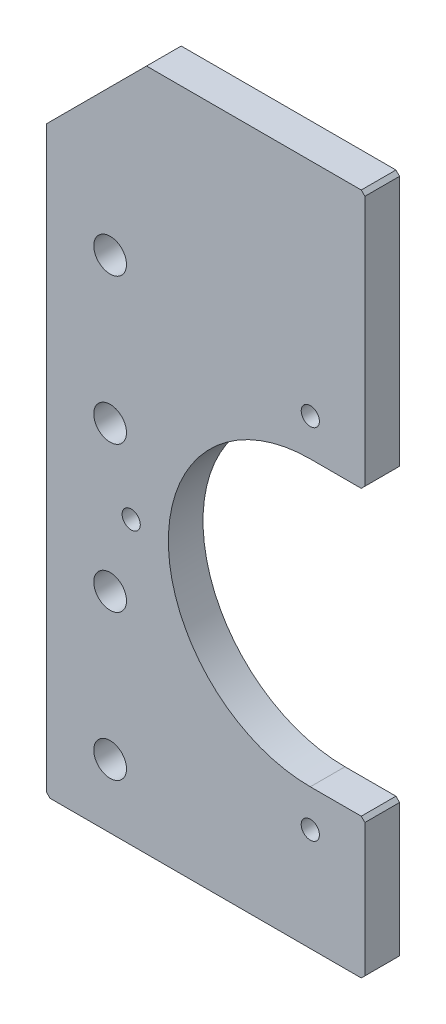
ISO-10303-21;
HEADER;
FILE_DESCRIPTION(('STEP AP214'),'2;1');
FILE_NAME('part.step','',(''),(''),'','','');
FILE_SCHEMA(('AUTOMOTIVE_DESIGN { 1 0 10303 214 1 1 1 1 }'));
ENDSEC;
DATA;
#1=APPLICATION_CONTEXT('core data for automotive mechanical design processes');
#2=APPLICATION_PROTOCOL_DEFINITION('international standard','automotive_design',2000,#1);
#3=PRODUCT_CONTEXT('',#1,'mechanical');
#4=PRODUCT('Part','Part','',(#3));
#5=PRODUCT_RELATED_PRODUCT_CATEGORY('part','',(#4));
#6=PRODUCT_DEFINITION_FORMATION('','',#4);
#7=PRODUCT_DEFINITION_CONTEXT('part definition',#1,'design');
#8=PRODUCT_DEFINITION('design','',#6,#7);
#9=PRODUCT_DEFINITION_SHAPE('','',#8);
#10=(LENGTH_UNIT() NAMED_UNIT(*) SI_UNIT(.MILLI.,.METRE.));
#11=(NAMED_UNIT(*) PLANE_ANGLE_UNIT() SI_UNIT($,.RADIAN.));
#12=(NAMED_UNIT(*) SI_UNIT($,.STERADIAN.) SOLID_ANGLE_UNIT());
#13=UNCERTAINTY_MEASURE_WITH_UNIT(LENGTH_MEASURE(1.E-05),#10,'distance_accuracy_value','');
#14=(GEOMETRIC_REPRESENTATION_CONTEXT(3) GLOBAL_UNCERTAINTY_ASSIGNED_CONTEXT((#13)) GLOBAL_UNIT_ASSIGNED_CONTEXT((#10,
#11,#12)) REPRESENTATION_CONTEXT('',''));
#15=CARTESIAN_POINT('',(0.,0.,0.));
#16=DIRECTION('',(0.,0.,1.));
#17=DIRECTION('',(1.,0.,0.));
#18=AXIS2_PLACEMENT_3D('',#15,#16,#17);
#19=CARTESIAN_POINT('',(0.,0.,4.7625));
#20=DIRECTION('',(0.,0.,-1.));
#21=DIRECTION('',(-1.,0.,0.));
#22=AXIS2_PLACEMENT_3D('',#19,#20,#21);
#23=CYLINDRICAL_SURFACE('',#22,39.);
#24=CARTESIAN_POINT('',(0.,0.,-4.7625));
#25=DIRECTION('',(0.,0.,-1.));
#26=DIRECTION('',(1.,0.,0.));
#27=AXIS2_PLACEMENT_3D('',#24,#25,#26);
#28=CIRCLE('',#27,39.);
#29=CARTESIAN_POINT('',(0.,-39.,-4.7625));
#30=VERTEX_POINT('',#29);
#31=CARTESIAN_POINT('',(0.,39.,-4.7625));
#32=VERTEX_POINT('',#31);
#33=EDGE_CURVE('E173',#30,#32,#28,.T.);
#34=ORIENTED_EDGE('',*,*,#33,.T.);
#35=DIRECTION('',(0.,0.,-1.));
#36=VECTOR('',#35,1.);
#37=CARTESIAN_POINT('',(0.,39.,4.7625));
#38=LINE('',#37,#36);
#39=CARTESIAN_POINT('',(0.,39.,4.7625));
#40=VERTEX_POINT('',#39);
#41=EDGE_CURVE('E154',#40,#32,#38,.T.);
#42=ORIENTED_EDGE('',*,*,#41,.F.);
#43=CARTESIAN_POINT('',(0.,0.,4.7625));
#44=DIRECTION('',(0.,0.,-1.));
#45=DIRECTION('',(1.,0.,0.));
#46=AXIS2_PLACEMENT_3D('',#43,#44,#45);
#47=CIRCLE('',#46,39.);
#48=CARTESIAN_POINT('',(0.,-39.,4.7625));
#49=VERTEX_POINT('',#48);
#50=EDGE_CURVE('E160',#49,#40,#47,.T.);
#51=ORIENTED_EDGE('',*,*,#50,.F.);
#52=DIRECTION('',(0.,0.,-1.));
#53=VECTOR('',#52,1.);
#54=CARTESIAN_POINT('',(0.,-39.,4.7625));
#55=LINE('',#54,#53);
#56=EDGE_CURVE('E301',#49,#30,#55,.T.);
#57=ORIENTED_EDGE('',*,*,#56,.T.);
#58=EDGE_LOOP('',(#34,#42,#51,#57));
#59=FACE_BOUND('',#58,.T.);
#60=ADVANCED_FACE('F44',(#59),#23,.F.);
#61=CARTESIAN_POINT('',(15.,39.,4.7625));
#62=DIRECTION('',(0.,1.,0.));
#63=DIRECTION('',(-1.,0.,0.));
#64=AXIS2_PLACEMENT_3D('',#61,#62,#63);
#65=PLANE('',#64);
#66=DIRECTION('',(1.,0.,0.));
#67=VECTOR('',#66,1.);
#68=CARTESIAN_POINT('',(15.,39.,-4.7625));
#69=LINE('',#68,#67);
#70=CARTESIAN_POINT('',(14.,39.,-4.7625));
#71=VERTEX_POINT('',#70);
#72=EDGE_CURVE('E276',#32,#71,#69,.T.);
#73=ORIENTED_EDGE('',*,*,#72,.T.);
#74=DIRECTION('',(0.,0.,1.));
#75=VECTOR('',#74,1.);
#76=CARTESIAN_POINT('',(14.,39.,4.7625));
#77=LINE('',#76,#75);
#78=CARTESIAN_POINT('',(14.,39.,4.7625));
#79=VERTEX_POINT('',#78);
#80=EDGE_CURVE('E54',#71,#79,#77,.T.);
#81=ORIENTED_EDGE('',*,*,#80,.T.);
#82=DIRECTION('',(1.,0.,0.));
#83=VECTOR('',#82,1.);
#84=CARTESIAN_POINT('',(15.,39.,4.7625));
#85=LINE('',#84,#83);
#86=EDGE_CURVE('E149',#40,#79,#85,.T.);
#87=ORIENTED_EDGE('',*,*,#86,.F.);
#88=ORIENTED_EDGE('',*,*,#41,.T.);
#89=EDGE_LOOP('',(#73,#81,#87,#88));
#90=FACE_BOUND('',#89,.T.);
#91=ADVANCED_FACE('F152',(#90),#65,.F.);
#92=CARTESIAN_POINT('',(15.,110.,4.7625));
#93=DIRECTION('',(-1.,0.,0.));
#94=DIRECTION('',(0.,-1.,0.));
#95=AXIS2_PLACEMENT_3D('',#92,#93,#94);
#96=PLANE('',#95);
#97=DIRECTION('',(0.,1.,0.));
#98=VECTOR('',#97,1.);
#99=CARTESIAN_POINT('',(15.,110.,4.7625));
#100=LINE('',#99,#98);
#101=CARTESIAN_POINT('',(15.,40.,4.7625));
#102=VERTEX_POINT('',#101);
#103=CARTESIAN_POINT('',(15.,109.,4.7625));
#104=VERTEX_POINT('',#103);
#105=EDGE_CURVE('E159',#102,#104,#100,.T.);
#106=ORIENTED_EDGE('',*,*,#105,.F.);
#107=DIRECTION('',(0.,0.,-1.));
#108=VECTOR('',#107,1.);
#109=CARTESIAN_POINT('',(15.,40.,4.7625));
#110=LINE('',#109,#108);
#111=CARTESIAN_POINT('',(15.,40.,-4.7625));
#112=VERTEX_POINT('',#111);
#113=EDGE_CURVE('E236',#102,#112,#110,.T.);
#114=ORIENTED_EDGE('',*,*,#113,.T.);
#115=DIRECTION('',(0.,1.,0.));
#116=VECTOR('',#115,1.);
#117=CARTESIAN_POINT('',(15.,110.,-4.7625));
#118=LINE('',#117,#116);
#119=CARTESIAN_POINT('',(15.,109.,-4.7625));
#120=VERTEX_POINT('',#119);
#121=EDGE_CURVE('E266',#112,#120,#118,.T.);
#122=ORIENTED_EDGE('',*,*,#121,.T.);
#123=DIRECTION('',(0.,0.,1.));
#124=VECTOR('',#123,1.);
#125=CARTESIAN_POINT('',(15.,109.,4.7625));
#126=LINE('',#125,#124);
#127=EDGE_CURVE('E233',#120,#104,#126,.T.);
#128=ORIENTED_EDGE('',*,*,#127,.T.);
#129=EDGE_LOOP('',(#106,#114,#122,#128));
#130=FACE_BOUND('',#129,.T.);
#131=ADVANCED_FACE('F265',(#130),#96,.F.);
#132=CARTESIAN_POINT('',(-45.,110.,4.7625));
#133=DIRECTION('',(0.,-1.,0.));
#134=DIRECTION('',(0.,0.,-1.));
#135=AXIS2_PLACEMENT_3D('',#132,#133,#134);
#136=PLANE('',#135);
#137=DIRECTION('',(-1.,0.,0.));
#138=VECTOR('',#137,1.);
#139=CARTESIAN_POINT('',(-45.,110.,4.7625));
#140=LINE('',#139,#138);
#141=CARTESIAN_POINT('',(14.,110.,4.7625));
#142=VERTEX_POINT('',#141);
#143=CARTESIAN_POINT('',(-45.,110.,4.7625));
#144=VERTEX_POINT('',#143);
#145=EDGE_CURVE('E357',#142,#144,#140,.T.);
#146=ORIENTED_EDGE('',*,*,#145,.F.);
#147=DIRECTION('',(0.,0.,-1.));
#148=VECTOR('',#147,1.);
#149=CARTESIAN_POINT('',(14.,110.,4.7625));
#150=LINE('',#149,#148);
#151=CARTESIAN_POINT('',(14.,110.,-4.7625));
#152=VERTEX_POINT('',#151);
#153=EDGE_CURVE('E11',#142,#152,#150,.T.);
#154=ORIENTED_EDGE('',*,*,#153,.T.);
#155=DIRECTION('',(-1.,0.,0.));
#156=VECTOR('',#155,1.);
#157=CARTESIAN_POINT('',(-45.,110.,-4.7625));
#158=LINE('',#157,#156);
#159=CARTESIAN_POINT('',(-45.,110.,-4.7625));
#160=VERTEX_POINT('',#159);
#161=EDGE_CURVE('E275',#152,#160,#158,.T.);
#162=ORIENTED_EDGE('',*,*,#161,.T.);
#163=DIRECTION('',(0.,0.,-1.));
#164=VECTOR('',#163,1.);
#165=CARTESIAN_POINT('',(-45.,110.,4.7625));
#166=LINE('',#165,#164);
#167=EDGE_CURVE('E176',#144,#160,#166,.T.);
#168=ORIENTED_EDGE('',*,*,#167,.F.);
#169=EDGE_LOOP('',(#146,#154,#162,#168));
#170=FACE_BOUND('',#169,.T.);
#171=ADVANCED_FACE('F365',(#170),#136,.F.);
#172=CARTESIAN_POINT('',(-72.5,82.4999999999999,4.7625));
#173=DIRECTION('',(0.707106781186549,-0.707106781186546,0.));
#174=DIRECTION('',(0.707106781186546,0.707106781186549,0.));
#175=AXIS2_PLACEMENT_3D('',#172,#173,#174);
#176=PLANE('',#175);
#177=DIRECTION('',(-0.707106781186546,-0.707106781186549,0.));
#178=VECTOR('',#177,1.);
#179=CARTESIAN_POINT('',(-72.5,82.4999999999999,-4.7625));
#180=LINE('',#179,#178);
#181=CARTESIAN_POINT('',(-72.5,82.4999999999999,-4.7625));
#182=VERTEX_POINT('',#181);
#183=EDGE_CURVE('E281',#160,#182,#180,.T.);
#184=ORIENTED_EDGE('',*,*,#183,.T.);
#185=DIRECTION('',(0.,0.,-1.));
#186=VECTOR('',#185,1.);
#187=CARTESIAN_POINT('',(-72.5,82.4999999999999,4.7625));
#188=LINE('',#187,#186);
#189=CARTESIAN_POINT('',(-72.5,82.4999999999999,4.7625));
#190=VERTEX_POINT('',#189);
#191=EDGE_CURVE('E184',#190,#182,#188,.T.);
#192=ORIENTED_EDGE('',*,*,#191,.F.);
#193=DIRECTION('',(-0.707106781186546,-0.707106781186549,0.));
#194=VECTOR('',#193,1.);
#195=CARTESIAN_POINT('',(-72.5,82.4999999999999,4.7625));
#196=LINE('',#195,#194);
#197=EDGE_CURVE('E334',#144,#190,#196,.T.);
#198=ORIENTED_EDGE('',*,*,#197,.F.);
#199=ORIENTED_EDGE('',*,*,#167,.T.);
#200=EDGE_LOOP('',(#184,#192,#198,#199));
#201=FACE_BOUND('',#200,.T.);
#202=ADVANCED_FACE('F363',(#201),#176,.F.);
#203=CARTESIAN_POINT('',(-72.5,-77.5,4.7625));
#204=DIRECTION('',(1.,0.,0.));
#205=DIRECTION('',(0.,0.,-1.));
#206=AXIS2_PLACEMENT_3D('',#203,#204,#205);
#207=PLANE('',#206);
#208=DIRECTION('',(0.,-1.,0.));
#209=VECTOR('',#208,1.);
#210=CARTESIAN_POINT('',(-72.5,-77.5,-4.7625));
#211=LINE('',#210,#209);
#212=CARTESIAN_POINT('',(-72.5,-76.5,-4.7625));
#213=VERTEX_POINT('',#212);
#214=EDGE_CURVE('E288',#182,#213,#211,.T.);
#215=ORIENTED_EDGE('',*,*,#214,.T.);
#216=DIRECTION('',(0.,0.,1.));
#217=VECTOR('',#216,1.);
#218=CARTESIAN_POINT('',(-72.5,-76.5,4.7625));
#219=LINE('',#218,#217);
#220=CARTESIAN_POINT('',(-72.5,-76.5,4.7625));
#221=VERTEX_POINT('',#220);
#222=EDGE_CURVE('E206',#213,#221,#219,.T.);
#223=ORIENTED_EDGE('',*,*,#222,.T.);
#224=DIRECTION('',(0.,-1.,0.));
#225=VECTOR('',#224,1.);
#226=CARTESIAN_POINT('',(-72.5,-77.5,4.7625));
#227=LINE('',#226,#225);
#228=EDGE_CURVE('E312',#190,#221,#227,.T.);
#229=ORIENTED_EDGE('',*,*,#228,.F.);
#230=ORIENTED_EDGE('',*,*,#191,.T.);
#231=EDGE_LOOP('',(#215,#223,#229,#230));
#232=FACE_BOUND('',#231,.T.);
#233=ADVANCED_FACE('F310',(#232),#207,.F.);
#234=CARTESIAN_POINT('',(15.,-77.5,4.7625));
#235=DIRECTION('',(0.,1.,0.));
#236=DIRECTION('',(-1.,0.,0.));
#237=AXIS2_PLACEMENT_3D('',#234,#235,#236);
#238=PLANE('',#237);
#239=DIRECTION('',(1.,0.,0.));
#240=VECTOR('',#239,1.);
#241=CARTESIAN_POINT('',(15.,-77.5,4.7625));
#242=LINE('',#241,#240);
#243=CARTESIAN_POINT('',(-71.5,-77.5,4.7625));
#244=VERTEX_POINT('',#243);
#245=CARTESIAN_POINT('',(14.,-77.5,4.7625));
#246=VERTEX_POINT('',#245);
#247=EDGE_CURVE('E325',#244,#246,#242,.T.);
#248=ORIENTED_EDGE('',*,*,#247,.F.);
#249=DIRECTION('',(0.,0.,-1.));
#250=VECTOR('',#249,1.);
#251=CARTESIAN_POINT('',(-71.5,-77.5,4.7625));
#252=LINE('',#251,#250);
#253=CARTESIAN_POINT('',(-71.5,-77.5,-4.7625));
#254=VERTEX_POINT('',#253);
#255=EDGE_CURVE('E181',#244,#254,#252,.T.);
#256=ORIENTED_EDGE('',*,*,#255,.T.);
#257=DIRECTION('',(1.,0.,0.));
#258=VECTOR('',#257,1.);
#259=CARTESIAN_POINT('',(15.,-77.5,-4.7625));
#260=LINE('',#259,#258);
#261=CARTESIAN_POINT('',(14.,-77.5,-4.7625));
#262=VERTEX_POINT('',#261);
#263=EDGE_CURVE('E292',#254,#262,#260,.T.);
#264=ORIENTED_EDGE('',*,*,#263,.T.);
#265=DIRECTION('',(0.,0.,1.));
#266=VECTOR('',#265,1.);
#267=CARTESIAN_POINT('',(14.,-77.5,4.7625));
#268=LINE('',#267,#266);
#269=EDGE_CURVE('E175',#262,#246,#268,.T.);
#270=ORIENTED_EDGE('',*,*,#269,.T.);
#271=EDGE_LOOP('',(#248,#256,#264,#270));
#272=FACE_BOUND('',#271,.T.);
#273=ADVANCED_FACE('F322',(#272),#238,.F.);
#274=CARTESIAN_POINT('',(15.,-39.,4.7625));
#275=DIRECTION('',(-1.,0.,0.));
#276=DIRECTION('',(0.,-1.,0.));
#277=AXIS2_PLACEMENT_3D('',#274,#275,#276);
#278=PLANE('',#277);
#279=DIRECTION('',(0.,1.,0.));
#280=VECTOR('',#279,1.);
#281=CARTESIAN_POINT('',(15.,-39.,4.7625));
#282=LINE('',#281,#280);
#283=CARTESIAN_POINT('',(15.,-76.5,4.7625));
#284=VERTEX_POINT('',#283);
#285=CARTESIAN_POINT('',(15.,-40.,4.7625));
#286=VERTEX_POINT('',#285);
#287=EDGE_CURVE('E328',#284,#286,#282,.T.);
#288=ORIENTED_EDGE('',*,*,#287,.F.);
#289=DIRECTION('',(0.,0.,-1.));
#290=VECTOR('',#289,1.);
#291=CARTESIAN_POINT('',(15.,-76.5,4.7625));
#292=LINE('',#291,#290);
#293=CARTESIAN_POINT('',(15.,-76.5,-4.7625));
#294=VERTEX_POINT('',#293);
#295=EDGE_CURVE('E225',#284,#294,#292,.T.);
#296=ORIENTED_EDGE('',*,*,#295,.T.);
#297=DIRECTION('',(0.,1.,0.));
#298=VECTOR('',#297,1.);
#299=CARTESIAN_POINT('',(15.,-39.,-4.7625));
#300=LINE('',#299,#298);
#301=CARTESIAN_POINT('',(15.,-40.,-4.7625));
#302=VERTEX_POINT('',#301);
#303=EDGE_CURVE('E296',#294,#302,#300,.T.);
#304=ORIENTED_EDGE('',*,*,#303,.T.);
#305=DIRECTION('',(0.,0.,1.));
#306=VECTOR('',#305,1.);
#307=CARTESIAN_POINT('',(15.,-40.,4.7625));
#308=LINE('',#307,#306);
#309=EDGE_CURVE('E69',#302,#286,#308,.T.);
#310=ORIENTED_EDGE('',*,*,#309,.T.);
#311=EDGE_LOOP('',(#288,#296,#304,#310));
#312=FACE_BOUND('',#311,.T.);
#313=ADVANCED_FACE('F409',(#312),#278,.F.);
#314=CARTESIAN_POINT('',(0.,-39.,4.7625));
#315=DIRECTION('',(0.,-1.,0.));
#316=DIRECTION('',(0.,0.,-1.));
#317=AXIS2_PLACEMENT_3D('',#314,#315,#316);
#318=PLANE('',#317);
#319=DIRECTION('',(-1.,0.,0.));
#320=VECTOR('',#319,1.);
#321=CARTESIAN_POINT('',(0.,-39.,4.7625));
#322=LINE('',#321,#320);
#323=CARTESIAN_POINT('',(14.,-39.,4.7625));
#324=VERTEX_POINT('',#323);
#325=EDGE_CURVE('E165',#324,#49,#322,.T.);
#326=ORIENTED_EDGE('',*,*,#325,.F.);
#327=DIRECTION('',(0.,0.,-1.));
#328=VECTOR('',#327,1.);
#329=CARTESIAN_POINT('',(14.,-39.,4.7625));
#330=LINE('',#329,#328);
#331=CARTESIAN_POINT('',(14.,-39.,-4.7625));
#332=VERTEX_POINT('',#331);
#333=EDGE_CURVE('E229',#324,#332,#330,.T.);
#334=ORIENTED_EDGE('',*,*,#333,.T.);
#335=DIRECTION('',(-1.,0.,0.));
#336=VECTOR('',#335,1.);
#337=CARTESIAN_POINT('',(0.,-39.,-4.7625));
#338=LINE('',#337,#336);
#339=EDGE_CURVE('E170',#332,#30,#338,.T.);
#340=ORIENTED_EDGE('',*,*,#339,.T.);
#341=ORIENTED_EDGE('',*,*,#56,.F.);
#342=EDGE_LOOP('',(#326,#334,#340,#341));
#343=FACE_BOUND('',#342,.T.);
#344=ADVANCED_FACE('F414',(#343),#318,.F.);
#345=CARTESIAN_POINT('',(0.,0.,4.7625));
#346=DIRECTION('',(0.,0.,1.));
#347=DIRECTION('',(1.,0.,0.));
#348=AXIS2_PLACEMENT_3D('',#345,#346,#347);
#349=PLANE('',#348);
#350=CARTESIAN_POINT('',(0.,49.2125,4.7625));
#351=DIRECTION('',(0.,0.,1.));
#352=DIRECTION('',(1.,0.,0.));
#353=AXIS2_PLACEMENT_3D('',#350,#351,#352);
#354=CIRCLE('',#353,2.5);
#355=CARTESIAN_POINT('',(2.5,49.2125,4.7625));
#356=VERTEX_POINT('',#355);
#357=EDGE_CURVE('E669',#356,#356,#354,.T.);
#358=ORIENTED_EDGE('',*,*,#357,.F.);
#359=EDGE_LOOP('',(#358));
#360=FACE_BOUND('',#359,.T.);
#361=CARTESIAN_POINT('',(-49.2125,0.,4.7625));
#362=DIRECTION('',(0.,0.,1.));
#363=DIRECTION('',(1.,0.,0.));
#364=AXIS2_PLACEMENT_3D('',#361,#362,#363);
#365=CIRCLE('',#364,2.5);
#366=CARTESIAN_POINT('',(-46.7125,0.,4.7625));
#367=VERTEX_POINT('',#366);
#368=EDGE_CURVE('E674',#367,#367,#365,.T.);
#369=ORIENTED_EDGE('',*,*,#368,.F.);
#370=EDGE_LOOP('',(#369));
#371=FACE_BOUND('',#370,.T.);
#372=CARTESIAN_POINT('',(0.,-49.2125,4.7625));
#373=DIRECTION('',(0.,0.,1.));
#374=DIRECTION('',(1.,0.,0.));
#375=AXIS2_PLACEMENT_3D('',#372,#373,#374);
#376=CIRCLE('',#375,2.5);
#377=CARTESIAN_POINT('',(2.5,-49.2125,4.7625));
#378=VERTEX_POINT('',#377);
#379=EDGE_CURVE('E684',#378,#378,#376,.T.);
#380=ORIENTED_EDGE('',*,*,#379,.F.);
#381=EDGE_LOOP('',(#380));
#382=FACE_BOUND('',#381,.T.);
#383=CARTESIAN_POINT('',(-55.,60.,4.7625));
#384=DIRECTION('',(0.,0.,1.));
#385=DIRECTION('',(1.,0.,0.));
#386=AXIS2_PLACEMENT_3D('',#383,#384,#385);
#387=CIRCLE('',#386,4.49999999999999);
#388=CARTESIAN_POINT('',(-50.5000000000001,60.,4.7625));
#389=VERTEX_POINT('',#388);
#390=EDGE_CURVE('E692',#389,#389,#387,.T.);
#391=ORIENTED_EDGE('',*,*,#390,.F.);
#392=EDGE_LOOP('',(#391));
#393=FACE_BOUND('',#392,.T.);
#394=CARTESIAN_POINT('',(-55.,20.,4.7625));
#395=DIRECTION('',(0.,0.,1.));
#396=DIRECTION('',(1.,0.,0.));
#397=AXIS2_PLACEMENT_3D('',#394,#395,#396);
#398=CIRCLE('',#397,4.49999999999999);
#399=CARTESIAN_POINT('',(-50.5000000000001,20.,4.7625));
#400=VERTEX_POINT('',#399);
#401=EDGE_CURVE('E700',#400,#400,#398,.T.);
#402=ORIENTED_EDGE('',*,*,#401,.F.);
#403=EDGE_LOOP('',(#402));
#404=FACE_BOUND('',#403,.T.);
#405=CARTESIAN_POINT('',(-55.,-20.,4.7625));
#406=DIRECTION('',(0.,0.,1.));
#407=DIRECTION('',(1.,0.,0.));
#408=AXIS2_PLACEMENT_3D('',#405,#406,#407);
#409=CIRCLE('',#408,4.49999999999999);
#410=CARTESIAN_POINT('',(-50.5000000000001,-20.,4.7625));
#411=VERTEX_POINT('',#410);
#412=EDGE_CURVE('E708',#411,#411,#409,.T.);
#413=ORIENTED_EDGE('',*,*,#412,.F.);
#414=EDGE_LOOP('',(#413));
#415=FACE_BOUND('',#414,.T.);
#416=CARTESIAN_POINT('',(-55.,-60.,4.7625));
#417=DIRECTION('',(0.,0.,1.));
#418=DIRECTION('',(1.,0.,0.));
#419=AXIS2_PLACEMENT_3D('',#416,#417,#418);
#420=CIRCLE('',#419,4.49999999999999);
#421=CARTESIAN_POINT('',(-50.5000000000001,-60.,4.7625));
#422=VERTEX_POINT('',#421);
#423=EDGE_CURVE('E344',#422,#422,#420,.T.);
#424=ORIENTED_EDGE('',*,*,#423,.F.);
#425=EDGE_LOOP('',(#424));
#426=FACE_BOUND('',#425,.T.);
#427=ORIENTED_EDGE('',*,*,#228,.T.);
#428=DIRECTION('',(-0.707106781186552,0.707106781186543,0.));
#429=VECTOR('',#428,1.);
#430=CARTESIAN_POINT('',(-74.4999999999995,-74.5000000000005,4.7625));
#431=LINE('',#430,#429);
#432=EDGE_CURVE('E220',#221,#244,#431,.F.);
#433=ORIENTED_EDGE('',*,*,#432,.T.);
#434=ORIENTED_EDGE('',*,*,#247,.T.);
#435=DIRECTION('',(-0.707106781186548,-0.707106781186548,0.));
#436=VECTOR('',#435,1.);
#437=CARTESIAN_POINT('',(45.75,-45.75,4.7625));
#438=LINE('',#437,#436);
#439=EDGE_CURVE('E217',#246,#284,#438,.F.);
#440=ORIENTED_EDGE('',*,*,#439,.T.);
#441=ORIENTED_EDGE('',*,*,#287,.T.);
#442=DIRECTION('',(0.707106781186538,-0.707106781186557,0.));
#443=VECTOR('',#442,1.);
#444=CARTESIAN_POINT('',(-12.4999999999998,-12.4999999999994,4.7625));
#445=LINE('',#444,#443);
#446=EDGE_CURVE('E61',#286,#324,#445,.F.);
#447=ORIENTED_EDGE('',*,*,#446,.T.);
#448=ORIENTED_EDGE('',*,*,#325,.T.);
#449=ORIENTED_EDGE('',*,*,#50,.T.);
#450=ORIENTED_EDGE('',*,*,#86,.T.);
#451=DIRECTION('',(-0.70710678118655,-0.707106781186545,0.));
#452=VECTOR('',#451,1.);
#453=CARTESIAN_POINT('',(-12.5000000000001,12.5000000000001,4.7625));
#454=LINE('',#453,#452);
#455=EDGE_CURVE('E212',#79,#102,#454,.F.);
#456=ORIENTED_EDGE('',*,*,#455,.T.);
#457=ORIENTED_EDGE('',*,*,#105,.T.);
#458=DIRECTION('',(0.707106781186548,-0.707106781186548,0.));
#459=VECTOR('',#458,1.);
#460=CARTESIAN_POINT('',(61.9999999999999,62.,4.7625));
#461=LINE('',#460,#459);
#462=EDGE_CURVE('E209',#104,#142,#461,.F.);
#463=ORIENTED_EDGE('',*,*,#462,.T.);
#464=ORIENTED_EDGE('',*,*,#145,.T.);
#465=ORIENTED_EDGE('',*,*,#197,.T.);
#466=EDGE_LOOP('',(#427,#433,#434,#440,#441,#447,#448,#449,#450,#456,#457,#463,#464,#465));
#467=FACE_BOUND('',#466,.T.);
#468=ADVANCED_FACE('F164',(#360,#371,#382,#393,#404,#415,#426,#467),#349,.T.);
#469=CARTESIAN_POINT('',(0.,0.,-4.7625));
#470=DIRECTION('',(0.,0.,1.));
#471=DIRECTION('',(1.,0.,0.));
#472=AXIS2_PLACEMENT_3D('',#469,#470,#471);
#473=PLANE('',#472);
#474=CARTESIAN_POINT('',(0.,49.2125,-4.7625));
#475=DIRECTION('',(0.,0.,1.));
#476=DIRECTION('',(1.,0.,0.));
#477=AXIS2_PLACEMENT_3D('',#474,#475,#476);
#478=CIRCLE('',#477,2.5);
#479=CARTESIAN_POINT('',(2.5,49.2125,-4.7625));
#480=VERTEX_POINT('',#479);
#481=EDGE_CURVE('E666',#480,#480,#478,.T.);
#482=ORIENTED_EDGE('',*,*,#481,.T.);
#483=EDGE_LOOP('',(#482));
#484=FACE_BOUND('',#483,.T.);
#485=CARTESIAN_POINT('',(-49.2125,0.,-4.7625));
#486=DIRECTION('',(0.,0.,1.));
#487=DIRECTION('',(1.,0.,0.));
#488=AXIS2_PLACEMENT_3D('',#485,#486,#487);
#489=CIRCLE('',#488,2.5);
#490=CARTESIAN_POINT('',(-46.7125,0.,-4.7625));
#491=VERTEX_POINT('',#490);
#492=EDGE_CURVE('E680',#491,#491,#489,.T.);
#493=ORIENTED_EDGE('',*,*,#492,.T.);
#494=EDGE_LOOP('',(#493));
#495=FACE_BOUND('',#494,.T.);
#496=CARTESIAN_POINT('',(0.,-49.2125,-4.7625));
#497=DIRECTION('',(0.,0.,1.));
#498=DIRECTION('',(1.,0.,0.));
#499=AXIS2_PLACEMENT_3D('',#496,#497,#498);
#500=CIRCLE('',#499,2.5);
#501=CARTESIAN_POINT('',(2.5,-49.2125,-4.7625));
#502=VERTEX_POINT('',#501);
#503=EDGE_CURVE('E688',#502,#502,#500,.T.);
#504=ORIENTED_EDGE('',*,*,#503,.T.);
#505=EDGE_LOOP('',(#504));
#506=FACE_BOUND('',#505,.T.);
#507=CARTESIAN_POINT('',(-55.,60.,-4.7625));
#508=DIRECTION('',(0.,0.,1.));
#509=DIRECTION('',(1.,0.,0.));
#510=AXIS2_PLACEMENT_3D('',#507,#508,#509);
#511=CIRCLE('',#510,4.49999999999999);
#512=CARTESIAN_POINT('',(-50.5000000000001,60.,-4.7625));
#513=VERTEX_POINT('',#512);
#514=EDGE_CURVE('E696',#513,#513,#511,.T.);
#515=ORIENTED_EDGE('',*,*,#514,.T.);
#516=EDGE_LOOP('',(#515));
#517=FACE_BOUND('',#516,.T.);
#518=CARTESIAN_POINT('',(-55.,20.,-4.7625));
#519=DIRECTION('',(0.,0.,1.));
#520=DIRECTION('',(1.,0.,0.));
#521=AXIS2_PLACEMENT_3D('',#518,#519,#520);
#522=CIRCLE('',#521,4.49999999999999);
#523=CARTESIAN_POINT('',(-50.5000000000001,20.,-4.7625));
#524=VERTEX_POINT('',#523);
#525=EDGE_CURVE('E704',#524,#524,#522,.T.);
#526=ORIENTED_EDGE('',*,*,#525,.T.);
#527=EDGE_LOOP('',(#526));
#528=FACE_BOUND('',#527,.T.);
#529=CARTESIAN_POINT('',(-55.,-20.,-4.7625));
#530=DIRECTION('',(0.,0.,1.));
#531=DIRECTION('',(1.,0.,0.));
#532=AXIS2_PLACEMENT_3D('',#529,#530,#531);
#533=CIRCLE('',#532,4.49999999999999);
#534=CARTESIAN_POINT('',(-50.5000000000001,-20.,-4.7625));
#535=VERTEX_POINT('',#534);
#536=EDGE_CURVE('E351',#535,#535,#533,.T.);
#537=ORIENTED_EDGE('',*,*,#536,.T.);
#538=EDGE_LOOP('',(#537));
#539=FACE_BOUND('',#538,.T.);
#540=CARTESIAN_POINT('',(-55.,-60.,-4.7625));
#541=DIRECTION('',(0.,0.,1.));
#542=DIRECTION('',(1.,0.,0.));
#543=AXIS2_PLACEMENT_3D('',#540,#541,#542);
#544=CIRCLE('',#543,4.49999999999999);
#545=CARTESIAN_POINT('',(-50.5000000000001,-60.,-4.7625));
#546=VERTEX_POINT('',#545);
#547=EDGE_CURVE('E340',#546,#546,#544,.T.);
#548=ORIENTED_EDGE('',*,*,#547,.T.);
#549=EDGE_LOOP('',(#548));
#550=FACE_BOUND('',#549,.T.);
#551=ORIENTED_EDGE('',*,*,#263,.F.);
#552=DIRECTION('',(0.707106781186552,-0.707106781186543,0.));
#553=VECTOR('',#552,1.);
#554=CARTESIAN_POINT('',(-71.5,-77.5,-4.7625));
#555=LINE('',#554,#553);
#556=EDGE_CURVE('E203',#254,#213,#555,.F.);
#557=ORIENTED_EDGE('',*,*,#556,.T.);
#558=ORIENTED_EDGE('',*,*,#214,.F.);
#559=ORIENTED_EDGE('',*,*,#183,.F.);
#560=ORIENTED_EDGE('',*,*,#161,.F.);
#561=DIRECTION('',(-0.707106781186548,0.707106781186548,0.));
#562=VECTOR('',#561,1.);
#563=CARTESIAN_POINT('',(14.,110.,-4.7625));
#564=LINE('',#563,#562);
#565=EDGE_CURVE('E191',#152,#120,#564,.F.);
#566=ORIENTED_EDGE('',*,*,#565,.T.);
#567=ORIENTED_EDGE('',*,*,#121,.F.);
#568=DIRECTION('',(0.70710678118655,0.707106781186545,0.));
#569=VECTOR('',#568,1.);
#570=CARTESIAN_POINT('',(15.,40.,-4.7625));
#571=LINE('',#570,#569);
#572=EDGE_CURVE('E194',#112,#71,#571,.F.);
#573=ORIENTED_EDGE('',*,*,#572,.T.);
#574=ORIENTED_EDGE('',*,*,#72,.F.);
#575=ORIENTED_EDGE('',*,*,#33,.F.);
#576=ORIENTED_EDGE('',*,*,#339,.F.);
#577=DIRECTION('',(-0.707106781186538,0.707106781186557,0.));
#578=VECTOR('',#577,1.);
#579=CARTESIAN_POINT('',(14.,-39.,-4.7625));
#580=LINE('',#579,#578);
#581=EDGE_CURVE('E197',#332,#302,#580,.F.);
#582=ORIENTED_EDGE('',*,*,#581,.T.);
#583=ORIENTED_EDGE('',*,*,#303,.F.);
#584=DIRECTION('',(0.707106781186548,0.707106781186548,0.));
#585=VECTOR('',#584,1.);
#586=CARTESIAN_POINT('',(15.,-76.5,-4.7625));
#587=LINE('',#586,#585);
#588=EDGE_CURVE('E200',#294,#262,#587,.F.);
#589=ORIENTED_EDGE('',*,*,#588,.T.);
#590=EDGE_LOOP('',(#551,#557,#558,#559,#560,#566,#567,#573,#574,#575,#576,#582,#583,#589));
#591=FACE_BOUND('',#590,.T.);
#592=ADVANCED_FACE('F272',(#484,#495,#506,#517,#528,#539,#550,#591),#473,.F.);
#593=CARTESIAN_POINT('',(-55.,-60.,4.7625));
#594=DIRECTION('',(0.,0.,1.));
#595=DIRECTION('',(1.,0.,0.));
#596=AXIS2_PLACEMENT_3D('',#593,#594,#595);
#597=CYLINDRICAL_SURFACE('',#596,4.49999999999999);
#598=ORIENTED_EDGE('',*,*,#547,.F.);
#599=EDGE_LOOP('',(#598));
#600=FACE_BOUND('',#599,.T.);
#601=ORIENTED_EDGE('',*,*,#423,.T.);
#602=EDGE_LOOP('',(#601));
#603=FACE_BOUND('',#602,.T.);
#604=ADVANCED_FACE('F477',(#600,#603),#597,.F.);
#605=CARTESIAN_POINT('',(-55.,-20.,4.7625));
#606=DIRECTION('',(0.,0.,1.));
#607=DIRECTION('',(1.,0.,0.));
#608=AXIS2_PLACEMENT_3D('',#605,#606,#607);
#609=CYLINDRICAL_SURFACE('',#608,4.49999999999999);
#610=ORIENTED_EDGE('',*,*,#536,.F.);
#611=EDGE_LOOP('',(#610));
#612=FACE_BOUND('',#611,.T.);
#613=ORIENTED_EDGE('',*,*,#412,.T.);
#614=EDGE_LOOP('',(#613));
#615=FACE_BOUND('',#614,.T.);
#616=ADVANCED_FACE('F486',(#612,#615),#609,.F.);
#617=CARTESIAN_POINT('',(-55.,20.,4.7625));
#618=DIRECTION('',(0.,0.,1.));
#619=DIRECTION('',(1.,0.,0.));
#620=AXIS2_PLACEMENT_3D('',#617,#618,#619);
#621=CYLINDRICAL_SURFACE('',#620,4.49999999999999);
#622=ORIENTED_EDGE('',*,*,#525,.F.);
#623=EDGE_LOOP('',(#622));
#624=FACE_BOUND('',#623,.T.);
#625=ORIENTED_EDGE('',*,*,#401,.T.);
#626=EDGE_LOOP('',(#625));
#627=FACE_BOUND('',#626,.T.);
#628=ADVANCED_FACE('F496',(#624,#627),#621,.F.);
#629=CARTESIAN_POINT('',(-55.,60.,4.7625));
#630=DIRECTION('',(0.,0.,1.));
#631=DIRECTION('',(1.,0.,0.));
#632=AXIS2_PLACEMENT_3D('',#629,#630,#631);
#633=CYLINDRICAL_SURFACE('',#632,4.49999999999999);
#634=ORIENTED_EDGE('',*,*,#514,.F.);
#635=EDGE_LOOP('',(#634));
#636=FACE_BOUND('',#635,.T.);
#637=ORIENTED_EDGE('',*,*,#390,.T.);
#638=EDGE_LOOP('',(#637));
#639=FACE_BOUND('',#638,.T.);
#640=ADVANCED_FACE('F506',(#636,#639),#633,.F.);
#641=CARTESIAN_POINT('',(0.,-49.2125,4.7625));
#642=DIRECTION('',(0.,0.,1.));
#643=DIRECTION('',(1.,0.,0.));
#644=AXIS2_PLACEMENT_3D('',#641,#642,#643);
#645=CYLINDRICAL_SURFACE('',#644,2.5);
#646=ORIENTED_EDGE('',*,*,#503,.F.);
#647=EDGE_LOOP('',(#646));
#648=FACE_BOUND('',#647,.T.);
#649=ORIENTED_EDGE('',*,*,#379,.T.);
#650=EDGE_LOOP('',(#649));
#651=FACE_BOUND('',#650,.T.);
#652=ADVANCED_FACE('F516',(#648,#651),#645,.F.);
#653=CARTESIAN_POINT('',(-49.2125,0.,4.7625));
#654=DIRECTION('',(0.,0.,1.));
#655=DIRECTION('',(1.,0.,0.));
#656=AXIS2_PLACEMENT_3D('',#653,#654,#655);
#657=CYLINDRICAL_SURFACE('',#656,2.5);
#658=ORIENTED_EDGE('',*,*,#492,.F.);
#659=EDGE_LOOP('',(#658));
#660=FACE_BOUND('',#659,.T.);
#661=ORIENTED_EDGE('',*,*,#368,.T.);
#662=EDGE_LOOP('',(#661));
#663=FACE_BOUND('',#662,.T.);
#664=ADVANCED_FACE('F526',(#660,#663),#657,.F.);
#665=CARTESIAN_POINT('',(0.,49.2125,4.7625));
#666=DIRECTION('',(0.,0.,1.));
#667=DIRECTION('',(1.,0.,0.));
#668=AXIS2_PLACEMENT_3D('',#665,#666,#667);
#669=CYLINDRICAL_SURFACE('',#668,2.5);
#670=ORIENTED_EDGE('',*,*,#481,.F.);
#671=EDGE_LOOP('',(#670));
#672=FACE_BOUND('',#671,.T.);
#673=ORIENTED_EDGE('',*,*,#357,.T.);
#674=EDGE_LOOP('',(#673));
#675=FACE_BOUND('',#674,.T.);
#676=ADVANCED_FACE('F394',(#672,#675),#669,.F.);
#677=CARTESIAN_POINT('',(-71.5,-77.5,4.7625));
#678=DIRECTION('',(0.707106781186542,0.707106781186552,0.));
#679=DIRECTION('',(0.,0.,-1.));
#680=AXIS2_PLACEMENT_3D('',#677,#678,#679);
#681=PLANE('',#680);
#682=ORIENTED_EDGE('',*,*,#432,.F.);
#683=ORIENTED_EDGE('',*,*,#222,.F.);
#684=ORIENTED_EDGE('',*,*,#556,.F.);
#685=ORIENTED_EDGE('',*,*,#255,.F.);
#686=EDGE_LOOP('',(#682,#683,#684,#685));
#687=FACE_BOUND('',#686,.T.);
#688=ADVANCED_FACE('F319',(#687),#681,.F.);
#689=CARTESIAN_POINT('',(15.,-76.5,4.7625));
#690=DIRECTION('',(-0.707106781186547,0.707106781186547,0.));
#691=DIRECTION('',(0.,0.,-1.));
#692=AXIS2_PLACEMENT_3D('',#689,#690,#691);
#693=PLANE('',#692);
#694=ORIENTED_EDGE('',*,*,#439,.F.);
#695=ORIENTED_EDGE('',*,*,#269,.F.);
#696=ORIENTED_EDGE('',*,*,#588,.F.);
#697=ORIENTED_EDGE('',*,*,#295,.F.);
#698=EDGE_LOOP('',(#694,#695,#696,#697));
#699=FACE_BOUND('',#698,.T.);
#700=ADVANCED_FACE('F376',(#699),#693,.F.);
#701=CARTESIAN_POINT('',(14.,-39.,4.7625));
#702=DIRECTION('',(-0.707106781186557,-0.707106781186538,0.));
#703=DIRECTION('',(0.,0.,-1.));
#704=AXIS2_PLACEMENT_3D('',#701,#702,#703);
#705=PLANE('',#704);
#706=ORIENTED_EDGE('',*,*,#446,.F.);
#707=ORIENTED_EDGE('',*,*,#309,.F.);
#708=ORIENTED_EDGE('',*,*,#581,.F.);
#709=ORIENTED_EDGE('',*,*,#333,.F.);
#710=EDGE_LOOP('',(#706,#707,#708,#709));
#711=FACE_BOUND('',#710,.T.);
#712=ADVANCED_FACE('F371',(#711),#705,.F.);
#713=CARTESIAN_POINT('',(15.,40.,4.7625));
#714=DIRECTION('',(-0.707106781186545,0.70710678118655,0.));
#715=DIRECTION('',(0.,0.,-1.));
#716=AXIS2_PLACEMENT_3D('',#713,#714,#715);
#717=PLANE('',#716);
#718=ORIENTED_EDGE('',*,*,#455,.F.);
#719=ORIENTED_EDGE('',*,*,#80,.F.);
#720=ORIENTED_EDGE('',*,*,#572,.F.);
#721=ORIENTED_EDGE('',*,*,#113,.F.);
#722=EDGE_LOOP('',(#718,#719,#720,#721));
#723=FACE_BOUND('',#722,.T.);
#724=ADVANCED_FACE('F369',(#723),#717,.F.);
#725=CARTESIAN_POINT('',(14.,110.,4.7625));
#726=DIRECTION('',(-0.707106781186547,-0.707106781186547,0.));
#727=DIRECTION('',(0.,0.,-1.));
#728=AXIS2_PLACEMENT_3D('',#725,#726,#727);
#729=PLANE('',#728);
#730=ORIENTED_EDGE('',*,*,#462,.F.);
#731=ORIENTED_EDGE('',*,*,#127,.F.);
#732=ORIENTED_EDGE('',*,*,#565,.F.);
#733=ORIENTED_EDGE('',*,*,#153,.F.);
#734=EDGE_LOOP('',(#730,#731,#732,#733));
#735=FACE_BOUND('',#734,.T.);
#736=ADVANCED_FACE('F47',(#735),#729,.F.);
#737=CLOSED_SHELL('',(#60,#91,#131,#171,#202,#233,#273,#313,#344,#468,#592,#604,#616,#628,#640,
#652,#664,#676,#688,#700,#712,#724,#736));
#738=MANIFOLD_SOLID_BREP('B2',#737);
#739=ADVANCED_BREP_SHAPE_REPRESENTATION('',(#18,#738),#14);
#740=SHAPE_DEFINITION_REPRESENTATION(#9,#739);
ENDSEC;
END-ISO-10303-21;
